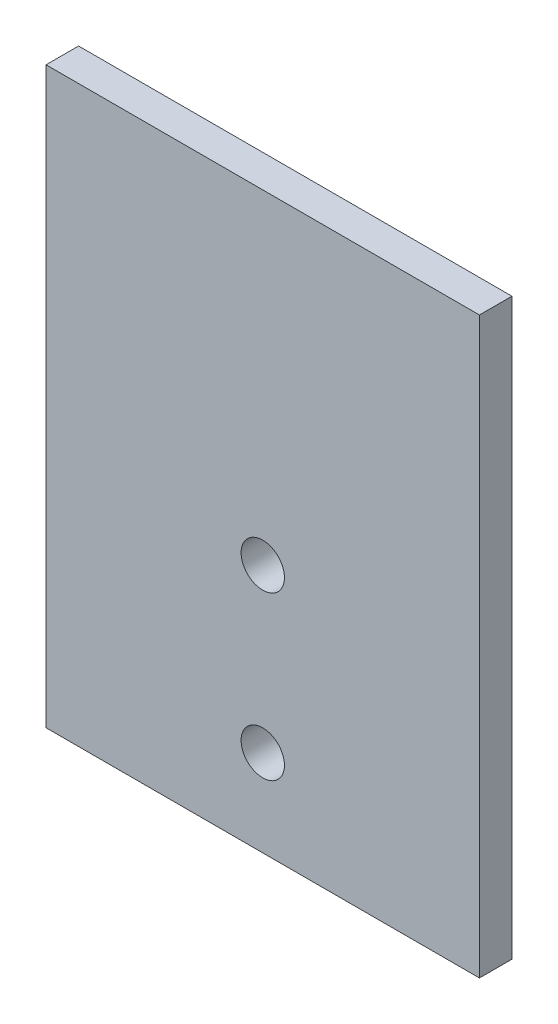
ISO-10303-21;
HEADER;
FILE_DESCRIPTION(('STEP AP214'),'2;1');
FILE_NAME('part.step','',(''),(''),'','','');
FILE_SCHEMA(('AUTOMOTIVE_DESIGN { 1 0 10303 214 1 1 1 1 }'));
ENDSEC;
DATA;
#1=APPLICATION_CONTEXT('core data for automotive mechanical design processes');
#2=APPLICATION_PROTOCOL_DEFINITION('international standard','automotive_design',2000,#1);
#3=PRODUCT_CONTEXT('',#1,'mechanical');
#4=PRODUCT('Part','Part','',(#3));
#5=PRODUCT_RELATED_PRODUCT_CATEGORY('part','',(#4));
#6=PRODUCT_DEFINITION_FORMATION('','',#4);
#7=PRODUCT_DEFINITION_CONTEXT('part definition',#1,'design');
#8=PRODUCT_DEFINITION('design','',#6,#7);
#9=PRODUCT_DEFINITION_SHAPE('','',#8);
#10=(LENGTH_UNIT() NAMED_UNIT(*) SI_UNIT(.MILLI.,.METRE.));
#11=(NAMED_UNIT(*) PLANE_ANGLE_UNIT() SI_UNIT($,.RADIAN.));
#12=(NAMED_UNIT(*) SI_UNIT($,.STERADIAN.) SOLID_ANGLE_UNIT());
#13=UNCERTAINTY_MEASURE_WITH_UNIT(LENGTH_MEASURE(1.E-05),#10,'distance_accuracy_value','');
#14=(GEOMETRIC_REPRESENTATION_CONTEXT(3) GLOBAL_UNCERTAINTY_ASSIGNED_CONTEXT((#13)) GLOBAL_UNIT_ASSIGNED_CONTEXT((#10,
#11,#12)) REPRESENTATION_CONTEXT('',''));
#15=CARTESIAN_POINT('',(0.,0.,0.));
#16=DIRECTION('',(0.,0.,1.));
#17=DIRECTION('',(1.,0.,0.));
#18=AXIS2_PLACEMENT_3D('',#15,#16,#17);
#19=CARTESIAN_POINT('',(20.,-26.5,3.));
#20=DIRECTION('',(-1.,0.,0.));
#21=DIRECTION('',(0.,0.,1.));
#22=AXIS2_PLACEMENT_3D('',#19,#20,#21);
#23=PLANE('',#22);
#24=DIRECTION('',(0.,1.,0.));
#25=VECTOR('',#24,1.);
#26=CARTESIAN_POINT('',(20.,-26.5,0.));
#27=LINE('',#26,#25);
#28=CARTESIAN_POINT('',(20.,-26.5,0.));
#29=VERTEX_POINT('',#28);
#30=CARTESIAN_POINT('',(20.,26.5,0.));
#31=VERTEX_POINT('',#30);
#32=EDGE_CURVE('E106',#29,#31,#27,.T.);
#33=ORIENTED_EDGE('',*,*,#32,.T.);
#34=DIRECTION('',(0.,0.,-1.));
#35=VECTOR('',#34,1.);
#36=CARTESIAN_POINT('',(20.,26.5,3.));
#37=LINE('',#36,#35);
#38=CARTESIAN_POINT('',(20.,26.5,3.));
#39=VERTEX_POINT('',#38);
#40=EDGE_CURVE('E11',#39,#31,#37,.T.);
#41=ORIENTED_EDGE('',*,*,#40,.F.);
#42=DIRECTION('',(0.,1.,0.));
#43=VECTOR('',#42,1.);
#44=CARTESIAN_POINT('',(20.,-26.5,3.));
#45=LINE('',#44,#43);
#46=CARTESIAN_POINT('',(20.,-26.5,3.));
#47=VERTEX_POINT('',#46);
#48=EDGE_CURVE('E94',#47,#39,#45,.T.);
#49=ORIENTED_EDGE('',*,*,#48,.F.);
#50=DIRECTION('',(0.,0.,-1.));
#51=VECTOR('',#50,1.);
#52=CARTESIAN_POINT('',(20.,-26.5,3.));
#53=LINE('',#52,#51);
#54=EDGE_CURVE('E102',#47,#29,#53,.T.);
#55=ORIENTED_EDGE('',*,*,#54,.T.);
#56=EDGE_LOOP('',(#33,#41,#49,#55));
#57=FACE_BOUND('',#56,.T.);
#58=ADVANCED_FACE('F43',(#57),#23,.F.);
#59=CARTESIAN_POINT('',(-20.,26.5,3.));
#60=DIRECTION('',(0.,-1.,0.));
#61=DIRECTION('',(0.,0.,-1.));
#62=AXIS2_PLACEMENT_3D('',#59,#60,#61);
#63=PLANE('',#62);
#64=DIRECTION('',(-1.,0.,0.));
#65=VECTOR('',#64,1.);
#66=CARTESIAN_POINT('',(-20.,26.5,0.));
#67=LINE('',#66,#65);
#68=CARTESIAN_POINT('',(-20.,26.5,0.));
#69=VERTEX_POINT('',#68);
#70=EDGE_CURVE('E98',#31,#69,#67,.T.);
#71=ORIENTED_EDGE('',*,*,#70,.T.);
#72=DIRECTION('',(0.,0.,-1.));
#73=VECTOR('',#72,1.);
#74=CARTESIAN_POINT('',(-20.,26.5,3.));
#75=LINE('',#74,#73);
#76=CARTESIAN_POINT('',(-20.,26.5,3.));
#77=VERTEX_POINT('',#76);
#78=EDGE_CURVE('E51',#77,#69,#75,.T.);
#79=ORIENTED_EDGE('',*,*,#78,.F.);
#80=DIRECTION('',(-1.,0.,0.));
#81=VECTOR('',#80,1.);
#82=CARTESIAN_POINT('',(-20.,26.5,3.));
#83=LINE('',#82,#81);
#84=EDGE_CURVE('E89',#39,#77,#83,.T.);
#85=ORIENTED_EDGE('',*,*,#84,.F.);
#86=ORIENTED_EDGE('',*,*,#40,.T.);
#87=EDGE_LOOP('',(#71,#79,#85,#86));
#88=FACE_BOUND('',#87,.T.);
#89=ADVANCED_FACE('F97',(#88),#63,.F.);
#90=CARTESIAN_POINT('',(-20.,-26.5,3.));
#91=DIRECTION('',(1.,0.,0.));
#92=DIRECTION('',(0.,0.,-1.));
#93=AXIS2_PLACEMENT_3D('',#90,#91,#92);
#94=PLANE('',#93);
#95=DIRECTION('',(0.,-1.,0.));
#96=VECTOR('',#95,1.);
#97=CARTESIAN_POINT('',(-20.,-26.5,0.));
#98=LINE('',#97,#96);
#99=CARTESIAN_POINT('',(-20.,-26.5,0.));
#100=VERTEX_POINT('',#99);
#101=EDGE_CURVE('E76',#69,#100,#98,.T.);
#102=ORIENTED_EDGE('',*,*,#101,.T.);
#103=DIRECTION('',(0.,0.,-1.));
#104=VECTOR('',#103,1.);
#105=CARTESIAN_POINT('',(-20.,-26.5,3.));
#106=LINE('',#105,#104);
#107=CARTESIAN_POINT('',(-20.,-26.5,3.));
#108=VERTEX_POINT('',#107);
#109=EDGE_CURVE('E99',#108,#100,#106,.T.);
#110=ORIENTED_EDGE('',*,*,#109,.F.);
#111=DIRECTION('',(0.,-1.,0.));
#112=VECTOR('',#111,1.);
#113=CARTESIAN_POINT('',(-20.,-26.5,3.));
#114=LINE('',#113,#112);
#115=EDGE_CURVE('E92',#77,#108,#114,.T.);
#116=ORIENTED_EDGE('',*,*,#115,.F.);
#117=ORIENTED_EDGE('',*,*,#78,.T.);
#118=EDGE_LOOP('',(#102,#110,#116,#117));
#119=FACE_BOUND('',#118,.T.);
#120=ADVANCED_FACE('F100',(#119),#94,.F.);
#121=CARTESIAN_POINT('',(-20.,-26.5,3.));
#122=DIRECTION('',(0.,1.,0.));
#123=DIRECTION('',(0.,0.,1.));
#124=AXIS2_PLACEMENT_3D('',#121,#122,#123);
#125=PLANE('',#124);
#126=DIRECTION('',(1.,0.,0.));
#127=VECTOR('',#126,1.);
#128=CARTESIAN_POINT('',(-20.,-26.5,0.));
#129=LINE('',#128,#127);
#130=EDGE_CURVE('E82',#100,#29,#129,.T.);
#131=ORIENTED_EDGE('',*,*,#130,.T.);
#132=ORIENTED_EDGE('',*,*,#54,.F.);
#133=DIRECTION('',(1.,0.,0.));
#134=VECTOR('',#133,1.);
#135=CARTESIAN_POINT('',(-20.,-26.5,3.));
#136=LINE('',#135,#134);
#137=EDGE_CURVE('E59',#108,#47,#136,.T.);
#138=ORIENTED_EDGE('',*,*,#137,.F.);
#139=ORIENTED_EDGE('',*,*,#109,.T.);
#140=EDGE_LOOP('',(#131,#132,#138,#139));
#141=FACE_BOUND('',#140,.T.);
#142=ADVANCED_FACE('F114',(#141),#125,.F.);
#143=CARTESIAN_POINT('',(0.,0.,3.));
#144=DIRECTION('',(0.,0.,-1.));
#145=DIRECTION('',(-1.,0.,0.));
#146=AXIS2_PLACEMENT_3D('',#143,#144,#145);
#147=PLANE('',#146);
#148=CARTESIAN_POINT('',(0.,-18.5,3.));
#149=DIRECTION('',(0.,0.,1.));
#150=DIRECTION('',(1.,0.,0.));
#151=AXIS2_PLACEMENT_3D('',#148,#149,#150);
#152=CIRCLE('',#151,2.);
#153=CARTESIAN_POINT('',(2.,-18.5,3.));
#154=VERTEX_POINT('',#153);
#155=EDGE_CURVE('E126',#154,#154,#152,.T.);
#156=ORIENTED_EDGE('',*,*,#155,.F.);
#157=EDGE_LOOP('',(#156));
#158=FACE_BOUND('',#157,.T.);
#159=CARTESIAN_POINT('',(0.,-3.5,3.));
#160=DIRECTION('',(0.,0.,1.));
#161=DIRECTION('',(1.,0.,0.));
#162=AXIS2_PLACEMENT_3D('',#159,#160,#161);
#163=CIRCLE('',#162,2.);
#164=CARTESIAN_POINT('',(2.,-3.5,3.));
#165=VERTEX_POINT('',#164);
#166=EDGE_CURVE('E123',#165,#165,#163,.T.);
#167=ORIENTED_EDGE('',*,*,#166,.F.);
#168=EDGE_LOOP('',(#167));
#169=FACE_BOUND('',#168,.T.);
#170=ORIENTED_EDGE('',*,*,#48,.T.);
#171=ORIENTED_EDGE('',*,*,#84,.T.);
#172=ORIENTED_EDGE('',*,*,#115,.T.);
#173=ORIENTED_EDGE('',*,*,#137,.T.);
#174=EDGE_LOOP('',(#170,#171,#172,#173));
#175=FACE_BOUND('',#174,.T.);
#176=ADVANCED_FACE('F90',(#158,#169,#175),#147,.F.);
#177=CARTESIAN_POINT('',(0.,0.,0.));
#178=DIRECTION('',(0.,0.,-1.));
#179=DIRECTION('',(-1.,0.,0.));
#180=AXIS2_PLACEMENT_3D('',#177,#178,#179);
#181=PLANE('',#180);
#182=CARTESIAN_POINT('',(0.,-18.5,0.));
#183=DIRECTION('',(0.,0.,1.));
#184=DIRECTION('',(1.,0.,0.));
#185=AXIS2_PLACEMENT_3D('',#182,#183,#184);
#186=CIRCLE('',#185,2.);
#187=CARTESIAN_POINT('',(2.,-18.5,0.));
#188=VERTEX_POINT('',#187);
#189=EDGE_CURVE('E109',#188,#188,#186,.T.);
#190=ORIENTED_EDGE('',*,*,#189,.T.);
#191=EDGE_LOOP('',(#190));
#192=FACE_BOUND('',#191,.T.);
#193=CARTESIAN_POINT('',(0.,-3.5,0.));
#194=DIRECTION('',(0.,0.,1.));
#195=DIRECTION('',(1.,0.,0.));
#196=AXIS2_PLACEMENT_3D('',#193,#194,#195);
#197=CIRCLE('',#196,2.);
#198=CARTESIAN_POINT('',(2.,-3.5,0.));
#199=VERTEX_POINT('',#198);
#200=EDGE_CURVE('E120',#199,#199,#197,.T.);
#201=ORIENTED_EDGE('',*,*,#200,.T.);
#202=EDGE_LOOP('',(#201));
#203=FACE_BOUND('',#202,.T.);
#204=ORIENTED_EDGE('',*,*,#32,.F.);
#205=ORIENTED_EDGE('',*,*,#130,.F.);
#206=ORIENTED_EDGE('',*,*,#101,.F.);
#207=ORIENTED_EDGE('',*,*,#70,.F.);
#208=EDGE_LOOP('',(#204,#205,#206,#207));
#209=FACE_BOUND('',#208,.T.);
#210=ADVANCED_FACE('F117',(#192,#203,#209),#181,.T.);
#211=CARTESIAN_POINT('',(0.,-3.5,0.));
#212=DIRECTION('',(0.,0.,1.));
#213=DIRECTION('',(1.,0.,0.));
#214=AXIS2_PLACEMENT_3D('',#211,#212,#213);
#215=CYLINDRICAL_SURFACE('',#214,2.);
#216=ORIENTED_EDGE('',*,*,#200,.F.);
#217=EDGE_LOOP('',(#216));
#218=FACE_BOUND('',#217,.T.);
#219=ORIENTED_EDGE('',*,*,#166,.T.);
#220=EDGE_LOOP('',(#219));
#221=FACE_BOUND('',#220,.T.);
#222=ADVANCED_FACE('F137',(#218,#221),#215,.F.);
#223=CARTESIAN_POINT('',(0.,-18.5,0.));
#224=DIRECTION('',(0.,0.,1.));
#225=DIRECTION('',(1.,0.,0.));
#226=AXIS2_PLACEMENT_3D('',#223,#224,#225);
#227=CYLINDRICAL_SURFACE('',#226,2.);
#228=ORIENTED_EDGE('',*,*,#189,.F.);
#229=EDGE_LOOP('',(#228));
#230=FACE_BOUND('',#229,.T.);
#231=ORIENTED_EDGE('',*,*,#155,.T.);
#232=EDGE_LOOP('',(#231));
#233=FACE_BOUND('',#232,.T.);
#234=ADVANCED_FACE('F134',(#230,#233),#227,.F.);
#235=CLOSED_SHELL('',(#58,#89,#120,#142,#176,#210,#222,#234));
#236=MANIFOLD_SOLID_BREP('B2',#235);
#237=ADVANCED_BREP_SHAPE_REPRESENTATION('',(#18,#236),#14);
#238=SHAPE_DEFINITION_REPRESENTATION(#9,#237);
ENDSEC;
END-ISO-10303-21;
